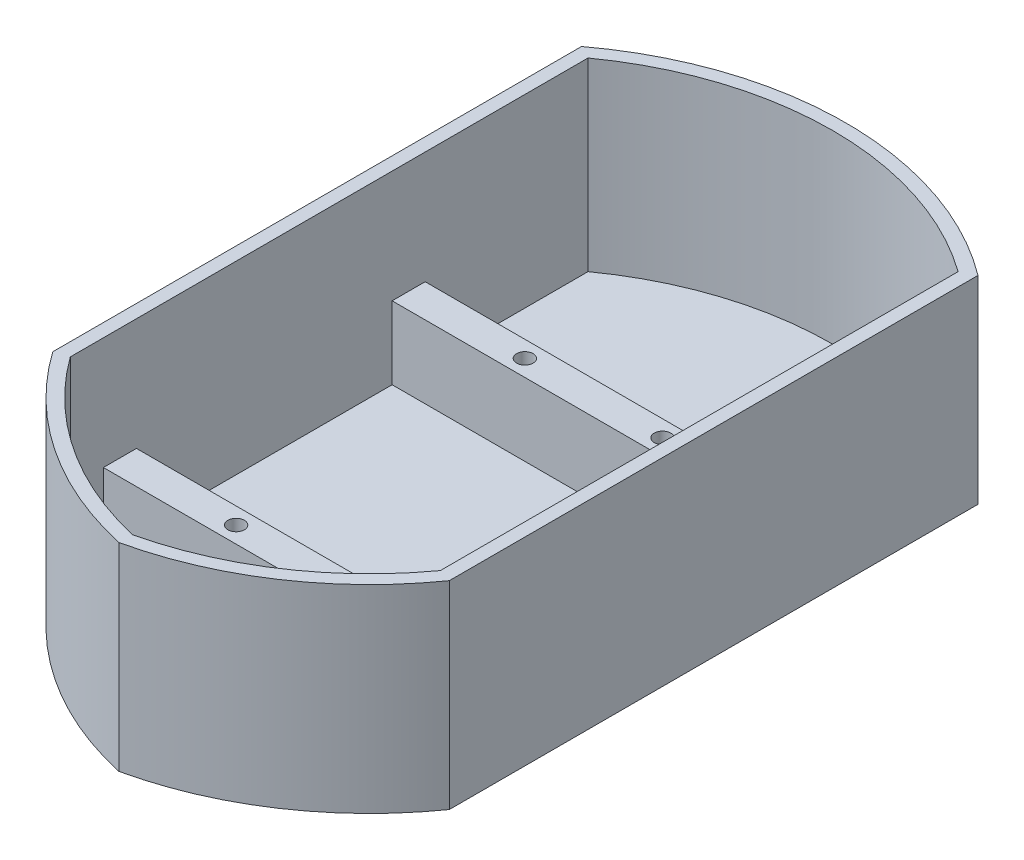
ISO-10303-21;
HEADER;
FILE_DESCRIPTION(('STEP AP214'),'2;1');
FILE_NAME('part.step','',(''),(''),'','','');
FILE_SCHEMA(('AUTOMOTIVE_DESIGN { 1 0 10303 214 1 1 1 1 }'));
ENDSEC;
DATA;
#1=APPLICATION_CONTEXT('core data for automotive mechanical design processes');
#2=APPLICATION_PROTOCOL_DEFINITION('international standard','automotive_design',2000,#1);
#3=PRODUCT_CONTEXT('',#1,'mechanical');
#4=PRODUCT('Part','Part','',(#3));
#5=PRODUCT_RELATED_PRODUCT_CATEGORY('part','',(#4));
#6=PRODUCT_DEFINITION_FORMATION('','',#4);
#7=PRODUCT_DEFINITION_CONTEXT('part definition',#1,'design');
#8=PRODUCT_DEFINITION('design','',#6,#7);
#9=PRODUCT_DEFINITION_SHAPE('','',#8);
#10=(LENGTH_UNIT() NAMED_UNIT(*) SI_UNIT(.MILLI.,.METRE.));
#11=(NAMED_UNIT(*) PLANE_ANGLE_UNIT() SI_UNIT($,.RADIAN.));
#12=(NAMED_UNIT(*) SI_UNIT($,.STERADIAN.) SOLID_ANGLE_UNIT());
#13=UNCERTAINTY_MEASURE_WITH_UNIT(LENGTH_MEASURE(1.E-05),#10,'distance_accuracy_value','');
#14=(GEOMETRIC_REPRESENTATION_CONTEXT(3) GLOBAL_UNCERTAINTY_ASSIGNED_CONTEXT((#13)) GLOBAL_UNIT_ASSIGNED_CONTEXT((#10,
#11,#12)) REPRESENTATION_CONTEXT('',''));
#15=CARTESIAN_POINT('',(0.,0.,0.));
#16=DIRECTION('',(0.,0.,1.));
#17=DIRECTION('',(1.,0.,0.));
#18=AXIS2_PLACEMENT_3D('',#15,#16,#17);
#19=CARTESIAN_POINT('',(-28.,30.,-40.));
#20=DIRECTION('',(1.,0.,0.));
#21=DIRECTION('',(0.,0.,-1.));
#22=AXIS2_PLACEMENT_3D('',#19,#20,#21);
#23=PLANE('',#22);
#24=DIRECTION('',(0.,0.,1.));
#25=VECTOR('',#24,1.);
#26=CARTESIAN_POINT('',(-28.,13.,-14.345));
#27=LINE('',#26,#25);
#28=CARTESIAN_POINT('',(-28.,13.,-14.345));
#29=VERTEX_POINT('',#28);
#30=CARTESIAN_POINT('',(-28.,13.,-9.34499999999999));
#31=VERTEX_POINT('',#30);
#32=EDGE_CURVE('E48',#29,#31,#27,.T.);
#33=ORIENTED_EDGE('',*,*,#32,.F.);
#34=DIRECTION('',(0.,-1.,0.));
#35=VECTOR('',#34,1.);
#36=CARTESIAN_POINT('',(-28.,13.,-14.345));
#37=LINE('',#36,#35);
#38=CARTESIAN_POINT('',(-28.,2.,-14.345));
#39=VERTEX_POINT('',#38);
#40=EDGE_CURVE('E192',#29,#39,#37,.T.);
#41=ORIENTED_EDGE('',*,*,#40,.T.);
#42=DIRECTION('',(0.,0.,1.));
#43=VECTOR('',#42,1.);
#44=CARTESIAN_POINT('',(-28.,2.,0.));
#45=LINE('',#44,#43);
#46=CARTESIAN_POINT('',(-28.,2.,-38.9871773792359));
#47=VERTEX_POINT('',#46);
#48=EDGE_CURVE('E233',#47,#39,#45,.T.);
#49=ORIENTED_EDGE('',*,*,#48,.F.);
#50=DIRECTION('',(0.,-1.,0.));
#51=VECTOR('',#50,1.);
#52=CARTESIAN_POINT('',(-28.,30.,-38.9871773792359));
#53=LINE('',#52,#51);
#54=CARTESIAN_POINT('',(-28.,30.,-38.9871773792359));
#55=VERTEX_POINT('',#54);
#56=EDGE_CURVE('E241',#55,#47,#53,.T.);
#57=ORIENTED_EDGE('',*,*,#56,.F.);
#58=DIRECTION('',(0.,0.,1.));
#59=VECTOR('',#58,1.);
#60=CARTESIAN_POINT('',(-28.,30.,0.));
#61=LINE('',#60,#59);
#62=CARTESIAN_POINT('',(-28.,30.,39.3588959212185));
#63=VERTEX_POINT('',#62);
#64=EDGE_CURVE('E262',#55,#63,#61,.T.);
#65=ORIENTED_EDGE('',*,*,#64,.T.);
#66=DIRECTION('',(0.,-1.,0.));
#67=VECTOR('',#66,1.);
#68=CARTESIAN_POINT('',(-28.,30.,39.3588959212185));
#69=LINE('',#68,#67);
#70=CARTESIAN_POINT('',(-28.,2.,39.3588959212185));
#71=VERTEX_POINT('',#70);
#72=EDGE_CURVE('E238',#63,#71,#69,.T.);
#73=ORIENTED_EDGE('',*,*,#72,.T.);
#74=CARTESIAN_POINT('',(-28.,2.,34.345));
#75=VERTEX_POINT('',#74);
#76=EDGE_CURVE('E232',#75,#71,#45,.T.);
#77=ORIENTED_EDGE('',*,*,#76,.F.);
#78=DIRECTION('',(0.,-1.,0.));
#79=VECTOR('',#78,1.);
#80=CARTESIAN_POINT('',(-28.,13.,34.345));
#81=LINE('',#80,#79);
#82=CARTESIAN_POINT('',(-28.,13.,34.345));
#83=VERTEX_POINT('',#82);
#84=EDGE_CURVE('E229',#83,#75,#81,.T.);
#85=ORIENTED_EDGE('',*,*,#84,.F.);
#86=DIRECTION('',(0.,0.,1.));
#87=VECTOR('',#86,1.);
#88=CARTESIAN_POINT('',(-28.,13.,34.345));
#89=LINE('',#88,#87);
#90=CARTESIAN_POINT('',(-28.,13.,29.345));
#91=VERTEX_POINT('',#90);
#92=EDGE_CURVE('E207',#91,#83,#89,.T.);
#93=ORIENTED_EDGE('',*,*,#92,.F.);
#94=DIRECTION('',(0.,-1.,0.));
#95=VECTOR('',#94,1.);
#96=CARTESIAN_POINT('',(-28.,13.,29.345));
#97=LINE('',#96,#95);
#98=CARTESIAN_POINT('',(-28.,2.,29.345));
#99=VERTEX_POINT('',#98);
#100=EDGE_CURVE('E219',#91,#99,#97,.T.);
#101=ORIENTED_EDGE('',*,*,#100,.T.);
#102=CARTESIAN_POINT('',(-28.,2.,-9.34499999999999));
#103=VERTEX_POINT('',#102);
#104=EDGE_CURVE('E237',#103,#99,#45,.T.);
#105=ORIENTED_EDGE('',*,*,#104,.F.);
#106=DIRECTION('',(0.,-1.,0.));
#107=VECTOR('',#106,1.);
#108=CARTESIAN_POINT('',(-28.,13.,-9.34499999999999));
#109=LINE('',#108,#107);
#110=EDGE_CURVE('E53',#31,#103,#109,.T.);
#111=ORIENTED_EDGE('',*,*,#110,.F.);
#112=EDGE_LOOP('',(#33,#41,#49,#57,#65,#73,#77,#85,#93,#101,#105,#111));
#113=FACE_BOUND('',#112,.T.);
#114=ADVANCED_FACE('F33',(#113),#23,.T.);
#115=CARTESIAN_POINT('',(28.,30.,-40.));
#116=DIRECTION('',(-1.,0.,0.));
#117=DIRECTION('',(0.,0.,1.));
#118=AXIS2_PLACEMENT_3D('',#115,#116,#117);
#119=PLANE('',#118);
#120=DIRECTION('',(0.,0.,-1.));
#121=VECTOR('',#120,1.);
#122=CARTESIAN_POINT('',(28.,2.,0.));
#123=LINE('',#122,#121);
#124=CARTESIAN_POINT('',(28.,2.,-14.345));
#125=VERTEX_POINT('',#124);
#126=CARTESIAN_POINT('',(28.,2.,-38.9871773792359));
#127=VERTEX_POINT('',#126);
#128=EDGE_CURVE('E166',#125,#127,#123,.T.);
#129=ORIENTED_EDGE('',*,*,#128,.F.);
#130=DIRECTION('',(0.,-1.,0.));
#131=VECTOR('',#130,1.);
#132=CARTESIAN_POINT('',(28.,13.,-14.345));
#133=LINE('',#132,#131);
#134=CARTESIAN_POINT('',(28.,13.,-14.345));
#135=VERTEX_POINT('',#134);
#136=EDGE_CURVE('E177',#135,#125,#133,.T.);
#137=ORIENTED_EDGE('',*,*,#136,.F.);
#138=DIRECTION('',(0.,0.,-1.));
#139=VECTOR('',#138,1.);
#140=CARTESIAN_POINT('',(28.,13.,-14.345));
#141=LINE('',#140,#139);
#142=CARTESIAN_POINT('',(28.,13.,-9.34499999999999));
#143=VERTEX_POINT('',#142);
#144=EDGE_CURVE('E173',#143,#135,#141,.T.);
#145=ORIENTED_EDGE('',*,*,#144,.F.);
#146=DIRECTION('',(0.,-1.,0.));
#147=VECTOR('',#146,1.);
#148=CARTESIAN_POINT('',(28.,13.,-9.34499999999999));
#149=LINE('',#148,#147);
#150=CARTESIAN_POINT('',(28.,2.,-9.34499999999999));
#151=VERTEX_POINT('',#150);
#152=EDGE_CURVE('E169',#143,#151,#149,.T.);
#153=ORIENTED_EDGE('',*,*,#152,.T.);
#154=CARTESIAN_POINT('',(28.,2.,29.345));
#155=VERTEX_POINT('',#154);
#156=EDGE_CURVE('E156',#155,#151,#123,.T.);
#157=ORIENTED_EDGE('',*,*,#156,.F.);
#158=DIRECTION('',(0.,-1.,0.));
#159=VECTOR('',#158,1.);
#160=CARTESIAN_POINT('',(28.,13.,29.345));
#161=LINE('',#160,#159);
#162=CARTESIAN_POINT('',(28.,13.,29.345));
#163=VERTEX_POINT('',#162);
#164=EDGE_CURVE('E225',#163,#155,#161,.T.);
#165=ORIENTED_EDGE('',*,*,#164,.F.);
#166=DIRECTION('',(0.,0.,-1.));
#167=VECTOR('',#166,1.);
#168=CARTESIAN_POINT('',(28.,13.,34.345));
#169=LINE('',#168,#167);
#170=CARTESIAN_POINT('',(28.,13.,34.345));
#171=VERTEX_POINT('',#170);
#172=EDGE_CURVE('E213',#171,#163,#169,.T.);
#173=ORIENTED_EDGE('',*,*,#172,.F.);
#174=DIRECTION('',(0.,-1.,0.));
#175=VECTOR('',#174,1.);
#176=CARTESIAN_POINT('',(28.,13.,34.345));
#177=LINE('',#176,#175);
#178=CARTESIAN_POINT('',(28.,2.,34.345));
#179=VERTEX_POINT('',#178);
#180=EDGE_CURVE('E227',#171,#179,#177,.T.);
#181=ORIENTED_EDGE('',*,*,#180,.T.);
#182=CARTESIAN_POINT('',(28.,2.,39.3588959212185));
#183=VERTEX_POINT('',#182);
#184=EDGE_CURVE('E165',#183,#179,#123,.T.);
#185=ORIENTED_EDGE('',*,*,#184,.F.);
#186=DIRECTION('',(0.,-1.,0.));
#187=VECTOR('',#186,1.);
#188=CARTESIAN_POINT('',(28.,30.,39.3588959212185));
#189=LINE('',#188,#187);
#190=CARTESIAN_POINT('',(28.,30.,39.3588959212185));
#191=VERTEX_POINT('',#190);
#192=EDGE_CURVE('E250',#191,#183,#189,.T.);
#193=ORIENTED_EDGE('',*,*,#192,.F.);
#194=DIRECTION('',(0.,0.,-1.));
#195=VECTOR('',#194,1.);
#196=CARTESIAN_POINT('',(28.,30.,0.));
#197=LINE('',#196,#195);
#198=CARTESIAN_POINT('',(28.,30.,-38.9871773792359));
#199=VERTEX_POINT('',#198);
#200=EDGE_CURVE('E259',#191,#199,#197,.T.);
#201=ORIENTED_EDGE('',*,*,#200,.T.);
#202=DIRECTION('',(0.,-1.,0.));
#203=VECTOR('',#202,1.);
#204=CARTESIAN_POINT('',(28.,30.,-38.9871773792359));
#205=LINE('',#204,#203);
#206=EDGE_CURVE('E253',#199,#127,#205,.T.);
#207=ORIENTED_EDGE('',*,*,#206,.T.);
#208=EDGE_LOOP('',(#129,#137,#145,#153,#157,#165,#173,#181,#185,#193,#201,#207));
#209=FACE_BOUND('',#208,.T.);
#210=ADVANCED_FACE('F171',(#209),#119,.T.);
#211=CARTESIAN_POINT('',(0.,2.,0.));
#212=DIRECTION('',(0.,-1.,0.));
#213=DIRECTION('',(0.,0.,-1.));
#214=AXIS2_PLACEMENT_3D('',#211,#212,#213);
#215=PLANE('',#214);
#216=DIRECTION('',(-1.,0.,0.));
#217=VECTOR('',#216,1.);
#218=CARTESIAN_POINT('',(28.,2.,-14.345));
#219=LINE('',#218,#217);
#220=EDGE_CURVE('E181',#125,#39,#219,.T.);
#221=ORIENTED_EDGE('',*,*,#220,.F.);
#222=ORIENTED_EDGE('',*,*,#128,.T.);
#223=CARTESIAN_POINT('',(0.,2.,0.));
#224=DIRECTION('',(0.,-1.,0.));
#225=DIRECTION('',(0.,0.,-1.));
#226=AXIS2_PLACEMENT_3D('',#223,#224,#225);
#227=CIRCLE('',#226,48.);
#228=EDGE_CURVE('E256',#127,#47,#227,.F.);
#229=ORIENTED_EDGE('',*,*,#228,.T.);
#230=ORIENTED_EDGE('',*,*,#48,.T.);
#231=EDGE_LOOP('',(#221,#222,#229,#230));
#232=FACE_BOUND('',#231,.T.);
#233=ADVANCED_FACE('F342',(#232),#215,.F.);
#234=DIRECTION('',(1.,0.,0.));
#235=VECTOR('',#234,1.);
#236=CARTESIAN_POINT('',(28.,2.,-9.34499999999999));
#237=LINE('',#236,#235);
#238=EDGE_CURVE('E160',#103,#151,#237,.T.);
#239=ORIENTED_EDGE('',*,*,#238,.F.);
#240=ORIENTED_EDGE('',*,*,#104,.T.);
#241=DIRECTION('',(-1.,0.,0.));
#242=VECTOR('',#241,1.);
#243=CARTESIAN_POINT('',(28.,2.,29.345));
#244=LINE('',#243,#242);
#245=EDGE_CURVE('E162',#155,#99,#244,.T.);
#246=ORIENTED_EDGE('',*,*,#245,.F.);
#247=ORIENTED_EDGE('',*,*,#156,.T.);
#248=EDGE_LOOP('',(#239,#240,#246,#247));
#249=FACE_BOUND('',#248,.T.);
#250=ADVANCED_FACE('F158',(#249),#215,.F.);
#251=DIRECTION('',(1.,0.,0.));
#252=VECTOR('',#251,1.);
#253=CARTESIAN_POINT('',(28.,2.,34.345));
#254=LINE('',#253,#252);
#255=EDGE_CURVE('E204',#75,#179,#254,.T.);
#256=ORIENTED_EDGE('',*,*,#255,.F.);
#257=ORIENTED_EDGE('',*,*,#76,.T.);
#258=CARTESIAN_POINT('',(10.8694949550773,2.,11.1957575673841));
#259=DIRECTION('',(0.,-1.,0.));
#260=DIRECTION('',(0.,0.,-1.));
#261=AXIS2_PLACEMENT_3D('',#258,#259,#260);
#262=CIRCLE('',#261,48.);
#263=CARTESIAN_POINT('',(0.,2.,57.9488759598673));
#264=VERTEX_POINT('',#263);
#265=EDGE_CURVE('E236',#71,#264,#262,.F.);
#266=ORIENTED_EDGE('',*,*,#265,.T.);
#267=CARTESIAN_POINT('',(-10.8694949550773,2.,11.1957575673841));
#268=DIRECTION('',(0.,-1.,0.));
#269=DIRECTION('',(0.,0.,-1.));
#270=AXIS2_PLACEMENT_3D('',#267,#268,#269);
#271=CIRCLE('',#270,48.);
#272=EDGE_CURVE('E247',#264,#183,#271,.F.);
#273=ORIENTED_EDGE('',*,*,#272,.T.);
#274=ORIENTED_EDGE('',*,*,#184,.T.);
#275=EDGE_LOOP('',(#256,#257,#266,#273,#274));
#276=FACE_BOUND('',#275,.T.);
#277=ADVANCED_FACE('F367',(#276),#215,.F.);
#278=CARTESIAN_POINT('',(0.,30.,0.));
#279=DIRECTION('',(0.,-1.,0.));
#280=DIRECTION('',(0.,0.,-1.));
#281=AXIS2_PLACEMENT_3D('',#278,#279,#280);
#282=PLANE('',#281);
#283=CARTESIAN_POINT('',(0.,30.,0.));
#284=DIRECTION('',(0.,1.,0.));
#285=DIRECTION('',(0.,0.,-1.));
#286=AXIS2_PLACEMENT_3D('',#283,#284,#285);
#287=CIRCLE('',#286,50.);
#288=CARTESIAN_POINT('',(30.,30.,-40.));
#289=VERTEX_POINT('',#288);
#290=CARTESIAN_POINT('',(-30.,30.,-40.));
#291=VERTEX_POINT('',#290);
#292=EDGE_CURVE('E271',#289,#291,#287,.T.);
#293=ORIENTED_EDGE('',*,*,#292,.T.);
#294=DIRECTION('',(0.,0.,1.));
#295=VECTOR('',#294,1.);
#296=CARTESIAN_POINT('',(-30.,30.,-40.));
#297=LINE('',#296,#295);
#298=CARTESIAN_POINT('',(-30.,30.,40.));
#299=VERTEX_POINT('',#298);
#300=EDGE_CURVE('E274',#291,#299,#297,.T.);
#301=ORIENTED_EDGE('',*,*,#300,.T.);
#302=CARTESIAN_POINT('',(10.8694949550773,30.,11.1957575673841));
#303=DIRECTION('',(0.,1.,0.));
#304=DIRECTION('',(0.,0.,1.));
#305=AXIS2_PLACEMENT_3D('',#302,#303,#304);
#306=CIRCLE('',#305,50.);
#307=CARTESIAN_POINT('',(0.,30.,60.));
#308=VERTEX_POINT('',#307);
#309=EDGE_CURVE('E277',#299,#308,#306,.T.);
#310=ORIENTED_EDGE('',*,*,#309,.T.);
#311=CARTESIAN_POINT('',(-10.8694949550773,30.,11.1957575673841));
#312=DIRECTION('',(0.,1.,0.));
#313=DIRECTION('',(0.,0.,1.));
#314=AXIS2_PLACEMENT_3D('',#311,#312,#313);
#315=CIRCLE('',#314,50.);
#316=CARTESIAN_POINT('',(30.,30.,40.));
#317=VERTEX_POINT('',#316);
#318=EDGE_CURVE('E279',#308,#317,#315,.T.);
#319=ORIENTED_EDGE('',*,*,#318,.T.);
#320=DIRECTION('',(0.,0.,-1.));
#321=VECTOR('',#320,1.);
#322=CARTESIAN_POINT('',(30.,30.,-40.));
#323=LINE('',#322,#321);
#324=EDGE_CURVE('E281',#317,#289,#323,.T.);
#325=ORIENTED_EDGE('',*,*,#324,.T.);
#326=EDGE_LOOP('',(#293,#301,#310,#319,#325));
#327=FACE_BOUND('',#326,.T.);
#328=CARTESIAN_POINT('',(0.,30.,0.));
#329=DIRECTION('',(0.,-1.,0.));
#330=DIRECTION('',(0.,0.,-1.));
#331=AXIS2_PLACEMENT_3D('',#328,#329,#330);
#332=CIRCLE('',#331,48.);
#333=EDGE_CURVE('E261',#199,#55,#332,.F.);
#334=ORIENTED_EDGE('',*,*,#333,.F.);
#335=ORIENTED_EDGE('',*,*,#200,.F.);
#336=CARTESIAN_POINT('',(-10.8694949550773,30.,11.1957575673841));
#337=DIRECTION('',(0.,-1.,0.));
#338=DIRECTION('',(0.,0.,-1.));
#339=AXIS2_PLACEMENT_3D('',#336,#337,#338);
#340=CIRCLE('',#339,48.);
#341=CARTESIAN_POINT('',(0.,30.,57.9488759598673));
#342=VERTEX_POINT('',#341);
#343=EDGE_CURVE('E266',#342,#191,#340,.F.);
#344=ORIENTED_EDGE('',*,*,#343,.F.);
#345=CARTESIAN_POINT('',(10.8694949550773,30.,11.1957575673841));
#346=DIRECTION('',(0.,-1.,0.));
#347=DIRECTION('',(0.,0.,-1.));
#348=AXIS2_PLACEMENT_3D('',#345,#346,#347);
#349=CIRCLE('',#348,48.);
#350=EDGE_CURVE('E264',#63,#342,#349,.F.);
#351=ORIENTED_EDGE('',*,*,#350,.F.);
#352=ORIENTED_EDGE('',*,*,#64,.F.);
#353=EDGE_LOOP('',(#334,#335,#344,#351,#352));
#354=FACE_BOUND('',#353,.T.);
#355=ADVANCED_FACE('F323',(#327,#354),#282,.F.);
#356=CARTESIAN_POINT('',(-30.,30.,-40.));
#357=DIRECTION('',(1.,0.,0.));
#358=DIRECTION('',(0.,0.,-1.));
#359=AXIS2_PLACEMENT_3D('',#356,#357,#358);
#360=PLANE('',#359);
#361=DIRECTION('',(0.,0.,1.));
#362=VECTOR('',#361,1.);
#363=CARTESIAN_POINT('',(-30.,0.,-40.));
#364=LINE('',#363,#362);
#365=CARTESIAN_POINT('',(-30.,0.,-40.));
#366=VERTEX_POINT('',#365);
#367=CARTESIAN_POINT('',(-30.,0.,40.));
#368=VERTEX_POINT('',#367);
#369=EDGE_CURVE('E245',#366,#368,#364,.T.);
#370=ORIENTED_EDGE('',*,*,#369,.T.);
#371=DIRECTION('',(0.,-1.,0.));
#372=VECTOR('',#371,1.);
#373=CARTESIAN_POINT('',(-30.,30.,40.));
#374=LINE('',#373,#372);
#375=EDGE_CURVE('E41',#299,#368,#374,.T.);
#376=ORIENTED_EDGE('',*,*,#375,.F.);
#377=ORIENTED_EDGE('',*,*,#300,.F.);
#378=DIRECTION('',(0.,-1.,0.));
#379=VECTOR('',#378,1.);
#380=CARTESIAN_POINT('',(-30.,30.,-40.));
#381=LINE('',#380,#379);
#382=EDGE_CURVE('E11',#291,#366,#381,.T.);
#383=ORIENTED_EDGE('',*,*,#382,.T.);
#384=EDGE_LOOP('',(#370,#376,#377,#383));
#385=FACE_BOUND('',#384,.T.);
#386=ADVANCED_FACE('F35',(#385),#360,.F.);
#387=CARTESIAN_POINT('',(10.8694949550773,30.,11.1957575673841));
#388=DIRECTION('',(0.,-1.,0.));
#389=DIRECTION('',(0.,0.,-1.));
#390=AXIS2_PLACEMENT_3D('',#387,#388,#389);
#391=CYLINDRICAL_SURFACE('',#390,50.);
#392=CARTESIAN_POINT('',(10.8694949550773,0.,11.1957575673841));
#393=DIRECTION('',(0.,1.,0.));
#394=DIRECTION('',(0.,0.,1.));
#395=AXIS2_PLACEMENT_3D('',#392,#393,#394);
#396=CIRCLE('',#395,50.);
#397=CARTESIAN_POINT('',(0.,0.,60.));
#398=VERTEX_POINT('',#397);
#399=EDGE_CURVE('E286',#368,#398,#396,.T.);
#400=ORIENTED_EDGE('',*,*,#399,.T.);
#401=DIRECTION('',(0.,-1.,0.));
#402=VECTOR('',#401,1.);
#403=CARTESIAN_POINT('',(0.,30.,60.));
#404=LINE('',#403,#402);
#405=EDGE_CURVE('E298',#308,#398,#404,.T.);
#406=ORIENTED_EDGE('',*,*,#405,.F.);
#407=ORIENTED_EDGE('',*,*,#309,.F.);
#408=ORIENTED_EDGE('',*,*,#375,.T.);
#409=EDGE_LOOP('',(#400,#406,#407,#408));
#410=FACE_BOUND('',#409,.T.);
#411=ADVANCED_FACE('F305',(#410),#391,.T.);
#412=CARTESIAN_POINT('',(-10.8694949550773,30.,11.1957575673841));
#413=DIRECTION('',(0.,-1.,0.));
#414=DIRECTION('',(0.,0.,-1.));
#415=AXIS2_PLACEMENT_3D('',#412,#413,#414);
#416=CYLINDRICAL_SURFACE('',#415,50.);
#417=CARTESIAN_POINT('',(-10.8694949550773,0.,11.1957575673841));
#418=DIRECTION('',(0.,1.,0.));
#419=DIRECTION('',(0.,0.,1.));
#420=AXIS2_PLACEMENT_3D('',#417,#418,#419);
#421=CIRCLE('',#420,50.);
#422=CARTESIAN_POINT('',(30.,0.,40.));
#423=VERTEX_POINT('',#422);
#424=EDGE_CURVE('E288',#398,#423,#421,.T.);
#425=ORIENTED_EDGE('',*,*,#424,.T.);
#426=DIRECTION('',(0.,-1.,0.));
#427=VECTOR('',#426,1.);
#428=CARTESIAN_POINT('',(30.,30.,40.));
#429=LINE('',#428,#427);
#430=EDGE_CURVE('E295',#317,#423,#429,.T.);
#431=ORIENTED_EDGE('',*,*,#430,.F.);
#432=ORIENTED_EDGE('',*,*,#318,.F.);
#433=ORIENTED_EDGE('',*,*,#405,.T.);
#434=EDGE_LOOP('',(#425,#431,#432,#433));
#435=FACE_BOUND('',#434,.T.);
#436=ADVANCED_FACE('F316',(#435),#416,.T.);
#437=CARTESIAN_POINT('',(30.,30.,-40.));
#438=DIRECTION('',(-1.,0.,0.));
#439=DIRECTION('',(0.,0.,1.));
#440=AXIS2_PLACEMENT_3D('',#437,#438,#439);
#441=PLANE('',#440);
#442=DIRECTION('',(0.,0.,-1.));
#443=VECTOR('',#442,1.);
#444=CARTESIAN_POINT('',(30.,0.,-40.));
#445=LINE('',#444,#443);
#446=CARTESIAN_POINT('',(30.,0.,-40.));
#447=VERTEX_POINT('',#446);
#448=EDGE_CURVE('E290',#423,#447,#445,.T.);
#449=ORIENTED_EDGE('',*,*,#448,.T.);
#450=DIRECTION('',(0.,-1.,0.));
#451=VECTOR('',#450,1.);
#452=CARTESIAN_POINT('',(30.,30.,-40.));
#453=LINE('',#452,#451);
#454=EDGE_CURVE('E284',#289,#447,#453,.T.);
#455=ORIENTED_EDGE('',*,*,#454,.F.);
#456=ORIENTED_EDGE('',*,*,#324,.F.);
#457=ORIENTED_EDGE('',*,*,#430,.T.);
#458=EDGE_LOOP('',(#449,#455,#456,#457));
#459=FACE_BOUND('',#458,.T.);
#460=ADVANCED_FACE('F320',(#459),#441,.F.);
#461=CARTESIAN_POINT('',(0.,30.,0.));
#462=DIRECTION('',(0.,-1.,0.));
#463=DIRECTION('',(0.,0.,-1.));
#464=AXIS2_PLACEMENT_3D('',#461,#462,#463);
#465=CYLINDRICAL_SURFACE('',#464,50.);
#466=CARTESIAN_POINT('',(0.,0.,0.));
#467=DIRECTION('',(0.,1.,0.));
#468=DIRECTION('',(0.,0.,1.));
#469=AXIS2_PLACEMENT_3D('',#466,#467,#468);
#470=CIRCLE('',#469,50.);
#471=EDGE_CURVE('E275',#447,#366,#470,.T.);
#472=ORIENTED_EDGE('',*,*,#471,.T.);
#473=ORIENTED_EDGE('',*,*,#382,.F.);
#474=ORIENTED_EDGE('',*,*,#292,.F.);
#475=ORIENTED_EDGE('',*,*,#454,.T.);
#476=EDGE_LOOP('',(#472,#473,#474,#475));
#477=FACE_BOUND('',#476,.T.);
#478=ADVANCED_FACE('F327',(#477),#465,.T.);
#479=CARTESIAN_POINT('',(0.,0.,0.));
#480=DIRECTION('',(0.,-1.,0.));
#481=DIRECTION('',(0.,0.,-1.));
#482=AXIS2_PLACEMENT_3D('',#479,#480,#481);
#483=PLANE('',#482);
#484=ORIENTED_EDGE('',*,*,#369,.F.);
#485=ORIENTED_EDGE('',*,*,#471,.F.);
#486=ORIENTED_EDGE('',*,*,#448,.F.);
#487=ORIENTED_EDGE('',*,*,#424,.F.);
#488=ORIENTED_EDGE('',*,*,#399,.F.);
#489=EDGE_LOOP('',(#484,#485,#486,#487,#488));
#490=FACE_BOUND('',#489,.T.);
#491=ADVANCED_FACE('F311',(#490),#483,.T.);
#492=CARTESIAN_POINT('',(10.8694949550773,30.,11.1957575673841));
#493=DIRECTION('',(0.,-1.,0.));
#494=DIRECTION('',(0.,0.,-1.));
#495=AXIS2_PLACEMENT_3D('',#492,#493,#494);
#496=CYLINDRICAL_SURFACE('',#495,48.);
#497=ORIENTED_EDGE('',*,*,#265,.F.);
#498=ORIENTED_EDGE('',*,*,#72,.F.);
#499=ORIENTED_EDGE('',*,*,#350,.T.);
#500=DIRECTION('',(0.,-1.,0.));
#501=VECTOR('',#500,1.);
#502=CARTESIAN_POINT('',(0.,30.,57.9488759598673));
#503=LINE('',#502,#501);
#504=EDGE_CURVE('E242',#342,#264,#503,.T.);
#505=ORIENTED_EDGE('',*,*,#504,.T.);
#506=EDGE_LOOP('',(#497,#498,#499,#505));
#507=FACE_BOUND('',#506,.T.);
#508=ADVANCED_FACE('F334',(#507),#496,.F.);
#509=CARTESIAN_POINT('',(-10.8694949550773,30.,11.1957575673841));
#510=DIRECTION('',(0.,-1.,0.));
#511=DIRECTION('',(0.,0.,-1.));
#512=AXIS2_PLACEMENT_3D('',#509,#510,#511);
#513=CYLINDRICAL_SURFACE('',#512,48.);
#514=ORIENTED_EDGE('',*,*,#272,.F.);
#515=ORIENTED_EDGE('',*,*,#504,.F.);
#516=ORIENTED_EDGE('',*,*,#343,.T.);
#517=ORIENTED_EDGE('',*,*,#192,.T.);
#518=EDGE_LOOP('',(#514,#515,#516,#517));
#519=FACE_BOUND('',#518,.T.);
#520=ADVANCED_FACE('F350',(#519),#513,.F.);
#521=CARTESIAN_POINT('',(0.,30.,0.));
#522=DIRECTION('',(0.,-1.,0.));
#523=DIRECTION('',(0.,0.,-1.));
#524=AXIS2_PLACEMENT_3D('',#521,#522,#523);
#525=CYLINDRICAL_SURFACE('',#524,48.);
#526=ORIENTED_EDGE('',*,*,#228,.F.);
#527=ORIENTED_EDGE('',*,*,#206,.F.);
#528=ORIENTED_EDGE('',*,*,#333,.T.);
#529=ORIENTED_EDGE('',*,*,#56,.T.);
#530=EDGE_LOOP('',(#526,#527,#528,#529));
#531=FACE_BOUND('',#530,.T.);
#532=ADVANCED_FACE('F353',(#531),#525,.F.);
#533=CARTESIAN_POINT('',(0.,13.,0.));
#534=DIRECTION('',(0.,1.,0.));
#535=DIRECTION('',(0.,0.,1.));
#536=AXIS2_PLACEMENT_3D('',#533,#534,#535);
#537=PLANE('',#536);
#538=CARTESIAN_POINT('',(-10.415,13.,31.845));
#539=DIRECTION('',(0.,1.,0.));
#540=DIRECTION('',(0.,0.,1.));
#541=AXIS2_PLACEMENT_3D('',#538,#539,#540);
#542=CIRCLE('',#541,1.25);
#543=CARTESIAN_POINT('',(-10.415,13.,33.095));
#544=VERTEX_POINT('',#543);
#545=EDGE_CURVE('E201',#544,#544,#542,.T.);
#546=ORIENTED_EDGE('',*,*,#545,.F.);
#547=EDGE_LOOP('',(#546));
#548=FACE_BOUND('',#547,.T.);
#549=ORIENTED_EDGE('',*,*,#92,.T.);
#550=DIRECTION('',(1.,0.,0.));
#551=VECTOR('',#550,1.);
#552=CARTESIAN_POINT('',(28.,13.,34.345));
#553=LINE('',#552,#551);
#554=EDGE_CURVE('E210',#83,#171,#553,.T.);
#555=ORIENTED_EDGE('',*,*,#554,.T.);
#556=ORIENTED_EDGE('',*,*,#172,.T.);
#557=DIRECTION('',(-1.,0.,0.));
#558=VECTOR('',#557,1.);
#559=CARTESIAN_POINT('',(28.,13.,29.345));
#560=LINE('',#559,#558);
#561=EDGE_CURVE('E216',#163,#91,#560,.T.);
#562=ORIENTED_EDGE('',*,*,#561,.T.);
#563=EDGE_LOOP('',(#549,#555,#556,#562));
#564=FACE_BOUND('',#563,.T.);
#565=CARTESIAN_POINT('',(10.415,13.,31.845));
#566=DIRECTION('',(0.,1.,0.));
#567=DIRECTION('',(0.,0.,1.));
#568=AXIS2_PLACEMENT_3D('',#565,#566,#567);
#569=CIRCLE('',#568,1.25);
#570=CARTESIAN_POINT('',(10.415,13.,33.095));
#571=VERTEX_POINT('',#570);
#572=EDGE_CURVE('E195',#571,#571,#569,.T.);
#573=ORIENTED_EDGE('',*,*,#572,.F.);
#574=EDGE_LOOP('',(#573));
#575=FACE_BOUND('',#574,.T.);
#576=ADVANCED_FACE('F358',(#548,#564,#575),#537,.T.);
#577=CARTESIAN_POINT('',(28.,13.,34.345));
#578=DIRECTION('',(0.,0.,-1.));
#579=DIRECTION('',(-1.,0.,0.));
#580=AXIS2_PLACEMENT_3D('',#577,#578,#579);
#581=PLANE('',#580);
#582=ORIENTED_EDGE('',*,*,#255,.T.);
#583=ORIENTED_EDGE('',*,*,#180,.F.);
#584=ORIENTED_EDGE('',*,*,#554,.F.);
#585=ORIENTED_EDGE('',*,*,#84,.T.);
#586=EDGE_LOOP('',(#582,#583,#584,#585));
#587=FACE_BOUND('',#586,.T.);
#588=ADVANCED_FACE('F346',(#587),#581,.F.);
#589=CARTESIAN_POINT('',(28.,13.,29.345));
#590=DIRECTION('',(0.,0.,1.));
#591=DIRECTION('',(1.,0.,0.));
#592=AXIS2_PLACEMENT_3D('',#589,#590,#591);
#593=PLANE('',#592);
#594=ORIENTED_EDGE('',*,*,#245,.T.);
#595=ORIENTED_EDGE('',*,*,#100,.F.);
#596=ORIENTED_EDGE('',*,*,#561,.F.);
#597=ORIENTED_EDGE('',*,*,#164,.T.);
#598=EDGE_LOOP('',(#594,#595,#596,#597));
#599=FACE_BOUND('',#598,.T.);
#600=ADVANCED_FACE('F429',(#599),#593,.F.);
#601=CARTESIAN_POINT('',(-10.415,13.,31.845));
#602=DIRECTION('',(0.,-1.,0.));
#603=DIRECTION('',(0.,0.,-1.));
#604=AXIS2_PLACEMENT_3D('',#601,#602,#603);
#605=CYLINDRICAL_SURFACE('',#604,1.25);
#606=ORIENTED_EDGE('',*,*,#545,.T.);
#607=EDGE_LOOP('',(#606));
#608=FACE_BOUND('',#607,.T.);
#609=CARTESIAN_POINT('',(-10.415,2.,31.845));
#610=DIRECTION('',(0.,1.,0.));
#611=DIRECTION('',(0.,0.,1.));
#612=AXIS2_PLACEMENT_3D('',#609,#610,#611);
#613=CIRCLE('',#612,1.25);
#614=CARTESIAN_POINT('',(-10.415,2.,33.095));
#615=VERTEX_POINT('',#614);
#616=EDGE_CURVE('E198',#615,#615,#613,.T.);
#617=ORIENTED_EDGE('',*,*,#616,.F.);
#618=EDGE_LOOP('',(#617));
#619=FACE_BOUND('',#618,.T.);
#620=ADVANCED_FACE('F440',(#608,#619),#605,.F.);
#621=CARTESIAN_POINT('',(10.415,13.,31.845));
#622=DIRECTION('',(0.,-1.,0.));
#623=DIRECTION('',(0.,0.,-1.));
#624=AXIS2_PLACEMENT_3D('',#621,#622,#623);
#625=CYLINDRICAL_SURFACE('',#624,1.25);
#626=ORIENTED_EDGE('',*,*,#572,.T.);
#627=EDGE_LOOP('',(#626));
#628=FACE_BOUND('',#627,.T.);
#629=CARTESIAN_POINT('',(10.415,2.,31.845));
#630=DIRECTION('',(0.,1.,0.));
#631=DIRECTION('',(0.,0.,1.));
#632=AXIS2_PLACEMENT_3D('',#629,#630,#631);
#633=CIRCLE('',#632,1.25);
#634=CARTESIAN_POINT('',(10.415,2.,33.095));
#635=VERTEX_POINT('',#634);
#636=EDGE_CURVE('E194',#635,#635,#633,.T.);
#637=ORIENTED_EDGE('',*,*,#636,.F.);
#638=EDGE_LOOP('',(#637));
#639=FACE_BOUND('',#638,.T.);
#640=ADVANCED_FACE('F449',(#628,#639),#625,.F.);
#641=ORIENTED_EDGE('',*,*,#616,.T.);
#642=EDGE_LOOP('',(#641));
#643=FACE_BOUND('',#642,.T.);
#644=ADVANCED_FACE('F364',(#643),#215,.F.);
#645=ORIENTED_EDGE('',*,*,#636,.T.);
#646=EDGE_LOOP('',(#645));
#647=FACE_BOUND('',#646,.T.);
#648=ADVANCED_FACE('F360',(#647),#215,.F.);
#649=CARTESIAN_POINT('',(0.,13.,0.));
#650=DIRECTION('',(0.,1.,0.));
#651=DIRECTION('',(0.,0.,1.));
#652=AXIS2_PLACEMENT_3D('',#649,#650,#651);
#653=PLANE('',#652);
#654=CARTESIAN_POINT('',(-10.415,13.,-11.845));
#655=DIRECTION('',(0.,1.,0.));
#656=DIRECTION('',(0.,0.,1.));
#657=AXIS2_PLACEMENT_3D('',#654,#655,#656);
#658=CIRCLE('',#657,1.25);
#659=CARTESIAN_POINT('',(-10.415,13.,-10.595));
#660=VERTEX_POINT('',#659);
#661=EDGE_CURVE('E185',#660,#660,#658,.T.);
#662=ORIENTED_EDGE('',*,*,#661,.F.);
#663=EDGE_LOOP('',(#662));
#664=FACE_BOUND('',#663,.T.);
#665=DIRECTION('',(-1.,0.,0.));
#666=VECTOR('',#665,1.);
#667=CARTESIAN_POINT('',(28.,13.,-14.345));
#668=LINE('',#667,#666);
#669=EDGE_CURVE('E180',#135,#29,#668,.T.);
#670=ORIENTED_EDGE('',*,*,#669,.T.);
#671=ORIENTED_EDGE('',*,*,#32,.T.);
#672=DIRECTION('',(1.,0.,0.));
#673=VECTOR('',#672,1.);
#674=CARTESIAN_POINT('',(28.,13.,-9.34499999999999));
#675=LINE('',#674,#673);
#676=EDGE_CURVE('E403',#31,#143,#675,.T.);
#677=ORIENTED_EDGE('',*,*,#676,.T.);
#678=ORIENTED_EDGE('',*,*,#144,.T.);
#679=EDGE_LOOP('',(#670,#671,#677,#678));
#680=FACE_BOUND('',#679,.T.);
#681=CARTESIAN_POINT('',(10.415,13.,-11.845));
#682=DIRECTION('',(0.,1.,0.));
#683=DIRECTION('',(0.,0.,1.));
#684=AXIS2_PLACEMENT_3D('',#681,#682,#683);
#685=CIRCLE('',#684,1.25);
#686=CARTESIAN_POINT('',(10.415,13.,-10.595));
#687=VERTEX_POINT('',#686);
#688=EDGE_CURVE('E393',#687,#687,#685,.T.);
#689=ORIENTED_EDGE('',*,*,#688,.F.);
#690=EDGE_LOOP('',(#689));
#691=FACE_BOUND('',#690,.T.);
#692=ADVANCED_FACE('F363',(#664,#680,#691),#653,.T.);
#693=CARTESIAN_POINT('',(28.,13.,-14.345));
#694=DIRECTION('',(0.,0.,1.));
#695=DIRECTION('',(1.,0.,0.));
#696=AXIS2_PLACEMENT_3D('',#693,#694,#695);
#697=PLANE('',#696);
#698=ORIENTED_EDGE('',*,*,#220,.T.);
#699=ORIENTED_EDGE('',*,*,#40,.F.);
#700=ORIENTED_EDGE('',*,*,#669,.F.);
#701=ORIENTED_EDGE('',*,*,#136,.T.);
#702=EDGE_LOOP('',(#698,#699,#700,#701));
#703=FACE_BOUND('',#702,.T.);
#704=ADVANCED_FACE('F409',(#703),#697,.F.);
#705=CARTESIAN_POINT('',(28.,13.,-9.34499999999999));
#706=DIRECTION('',(0.,0.,-1.));
#707=DIRECTION('',(-1.,0.,0.));
#708=AXIS2_PLACEMENT_3D('',#705,#706,#707);
#709=PLANE('',#708);
#710=ORIENTED_EDGE('',*,*,#238,.T.);
#711=ORIENTED_EDGE('',*,*,#152,.F.);
#712=ORIENTED_EDGE('',*,*,#676,.F.);
#713=ORIENTED_EDGE('',*,*,#110,.T.);
#714=EDGE_LOOP('',(#710,#711,#712,#713));
#715=FACE_BOUND('',#714,.T.);
#716=ADVANCED_FACE('F179',(#715),#709,.F.);
#717=CARTESIAN_POINT('',(-10.415,13.,-11.845));
#718=DIRECTION('',(0.,-1.,0.));
#719=DIRECTION('',(0.,0.,-1.));
#720=AXIS2_PLACEMENT_3D('',#717,#718,#719);
#721=CYLINDRICAL_SURFACE('',#720,1.25);
#722=ORIENTED_EDGE('',*,*,#661,.T.);
#723=EDGE_LOOP('',(#722));
#724=FACE_BOUND('',#723,.T.);
#725=CARTESIAN_POINT('',(-10.415,2.,-11.845));
#726=DIRECTION('',(0.,1.,0.));
#727=DIRECTION('',(0.,0.,1.));
#728=AXIS2_PLACEMENT_3D('',#725,#726,#727);
#729=CIRCLE('',#728,1.25);
#730=CARTESIAN_POINT('',(-10.415,2.,-10.595));
#731=VERTEX_POINT('',#730);
#732=EDGE_CURVE('E391',#731,#731,#729,.T.);
#733=ORIENTED_EDGE('',*,*,#732,.F.);
#734=EDGE_LOOP('',(#733));
#735=FACE_BOUND('',#734,.T.);
#736=ADVANCED_FACE('F386',(#724,#735),#721,.F.);
#737=CARTESIAN_POINT('',(10.415,13.,-11.845));
#738=DIRECTION('',(0.,-1.,0.));
#739=DIRECTION('',(0.,0.,-1.));
#740=AXIS2_PLACEMENT_3D('',#737,#738,#739);
#741=CYLINDRICAL_SURFACE('',#740,1.25);
#742=ORIENTED_EDGE('',*,*,#688,.T.);
#743=EDGE_LOOP('',(#742));
#744=FACE_BOUND('',#743,.T.);
#745=CARTESIAN_POINT('',(10.415,2.,-11.845));
#746=DIRECTION('',(0.,1.,0.));
#747=DIRECTION('',(0.,0.,1.));
#748=AXIS2_PLACEMENT_3D('',#745,#746,#747);
#749=CIRCLE('',#748,1.25);
#750=CARTESIAN_POINT('',(10.415,2.,-10.595));
#751=VERTEX_POINT('',#750);
#752=EDGE_CURVE('E398',#751,#751,#749,.T.);
#753=ORIENTED_EDGE('',*,*,#752,.F.);
#754=EDGE_LOOP('',(#753));
#755=FACE_BOUND('',#754,.T.);
#756=ADVANCED_FACE('F381',(#744,#755),#741,.F.);
#757=ORIENTED_EDGE('',*,*,#732,.T.);
#758=EDGE_LOOP('',(#757));
#759=FACE_BOUND('',#758,.T.);
#760=ADVANCED_FACE('F374',(#759),#215,.F.);
#761=ORIENTED_EDGE('',*,*,#752,.T.);
#762=EDGE_LOOP('',(#761));
#763=FACE_BOUND('',#762,.T.);
#764=ADVANCED_FACE('F373',(#763),#215,.F.);
#765=CLOSED_SHELL('',(#114,#210,#233,#250,#277,#355,#386,#411,#436,#460,#478,#491,#508,#520,
#532,#576,#588,#600,#620,#640,#644,#648,#692,#704,#716,#736,#756,#760,#764));
#766=MANIFOLD_SOLID_BREP('B2',#765);
#767=ADVANCED_BREP_SHAPE_REPRESENTATION('',(#18,#766),#14);
#768=SHAPE_DEFINITION_REPRESENTATION(#9,#767);
ENDSEC;
END-ISO-10303-21;
